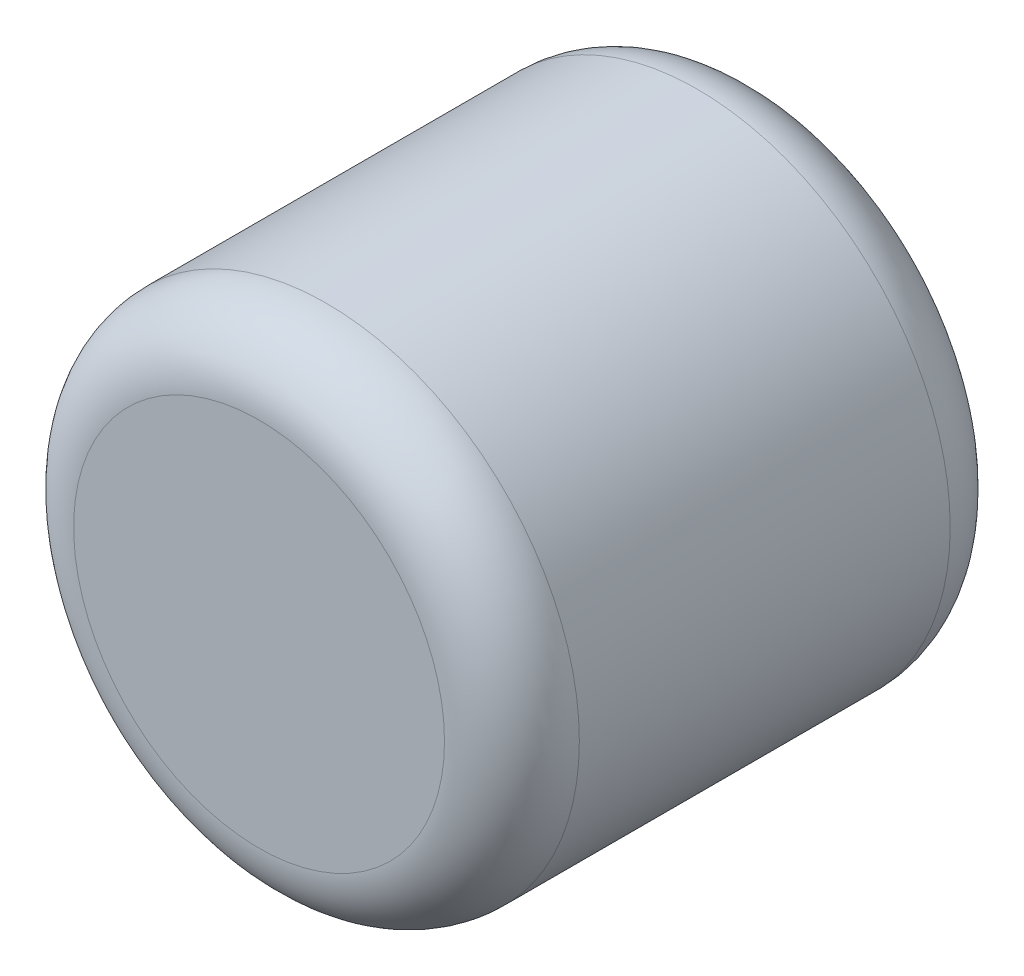
ISO-10303-21;
HEADER;
FILE_DESCRIPTION(('STEP AP214'),'2;1');
FILE_NAME('part.step','',(''),(''),'','','');
FILE_SCHEMA(('AUTOMOTIVE_DESIGN { 1 0 10303 214 1 1 1 1 }'));
ENDSEC;
DATA;
#1=APPLICATION_CONTEXT('core data for automotive mechanical design processes');
#2=APPLICATION_PROTOCOL_DEFINITION('international standard','automotive_design',2000,#1);
#3=PRODUCT_CONTEXT('',#1,'mechanical');
#4=PRODUCT('Part','Part','',(#3));
#5=PRODUCT_RELATED_PRODUCT_CATEGORY('part','',(#4));
#6=PRODUCT_DEFINITION_FORMATION('','',#4);
#7=PRODUCT_DEFINITION_CONTEXT('part definition',#1,'design');
#8=PRODUCT_DEFINITION('design','',#6,#7);
#9=PRODUCT_DEFINITION_SHAPE('','',#8);
#10=(LENGTH_UNIT() NAMED_UNIT(*) SI_UNIT(.MILLI.,.METRE.));
#11=(NAMED_UNIT(*) PLANE_ANGLE_UNIT() SI_UNIT($,.RADIAN.));
#12=(NAMED_UNIT(*) SI_UNIT($,.STERADIAN.) SOLID_ANGLE_UNIT());
#13=UNCERTAINTY_MEASURE_WITH_UNIT(LENGTH_MEASURE(1.E-05),#10,'distance_accuracy_value','');
#14=(GEOMETRIC_REPRESENTATION_CONTEXT(3) GLOBAL_UNCERTAINTY_ASSIGNED_CONTEXT((#13)) GLOBAL_UNIT_ASSIGNED_CONTEXT((#10,
#11,#12)) REPRESENTATION_CONTEXT('',''));
#15=CARTESIAN_POINT('',(0.,0.,0.));
#16=DIRECTION('',(0.,0.,1.));
#17=DIRECTION('',(1.,0.,0.));
#18=AXIS2_PLACEMENT_3D('',#15,#16,#17);
#19=CARTESIAN_POINT('',(0.,0.,30.));
#20=DIRECTION('',(0.,0.,-1.));
#21=DIRECTION('',(-1.,0.,0.));
#22=AXIS2_PLACEMENT_3D('',#19,#20,#21);
#23=CYLINDRICAL_SURFACE('',#22,15.);
#24=CARTESIAN_POINT('',(0.,0.,4.));
#25=DIRECTION('',(0.,0.,1.));
#26=DIRECTION('',(1.,0.,0.));
#27=AXIS2_PLACEMENT_3D('',#24,#25,#26);
#28=CIRCLE('',#27,15.);
#29=CARTESIAN_POINT('',(15.,0.,4.));
#30=VERTEX_POINT('',#29);
#31=EDGE_CURVE('E37',#30,#30,#28,.T.);
#32=ORIENTED_EDGE('',*,*,#31,.T.);
#33=EDGE_LOOP('',(#32));
#34=FACE_BOUND('',#33,.T.);
#35=CARTESIAN_POINT('',(0.,0.,26.));
#36=DIRECTION('',(0.,0.,1.));
#37=DIRECTION('',(1.,0.,0.));
#38=AXIS2_PLACEMENT_3D('',#35,#36,#37);
#39=CIRCLE('',#38,15.);
#40=CARTESIAN_POINT('',(15.,0.,26.));
#41=VERTEX_POINT('',#40);
#42=EDGE_CURVE('E41',#41,#41,#39,.F.);
#43=ORIENTED_EDGE('',*,*,#42,.T.);
#44=EDGE_LOOP('',(#43));
#45=FACE_BOUND('',#44,.T.);
#46=ADVANCED_FACE('F30',(#34,#45),#23,.T.);
#47=CARTESIAN_POINT('',(0.,0.,30.));
#48=DIRECTION('',(0.,0.,1.));
#49=DIRECTION('',(1.,0.,0.));
#50=AXIS2_PLACEMENT_3D('',#47,#48,#49);
#51=PLANE('',#50);
#52=CARTESIAN_POINT('',(0.,0.,30.));
#53=DIRECTION('',(0.,0.,1.));
#54=DIRECTION('',(1.,0.,0.));
#55=AXIS2_PLACEMENT_3D('',#52,#53,#54);
#56=CIRCLE('',#55,11.);
#57=CARTESIAN_POINT('',(11.,0.,30.));
#58=VERTEX_POINT('',#57);
#59=EDGE_CURVE('E45',#58,#58,#56,.T.);
#60=ORIENTED_EDGE('',*,*,#59,.T.);
#61=EDGE_LOOP('',(#60));
#62=FACE_BOUND('',#61,.T.);
#63=ADVANCED_FACE('F51',(#62),#51,.T.);
#64=CARTESIAN_POINT('',(0.,0.,0.));
#65=DIRECTION('',(0.,0.,1.));
#66=DIRECTION('',(1.,0.,0.));
#67=AXIS2_PLACEMENT_3D('',#64,#65,#66);
#68=PLANE('',#67);
#69=CARTESIAN_POINT('',(0.,0.,0.));
#70=DIRECTION('',(0.,0.,1.));
#71=DIRECTION('',(1.,0.,0.));
#72=AXIS2_PLACEMENT_3D('',#69,#70,#71);
#73=CIRCLE('',#72,11.);
#74=CARTESIAN_POINT('',(11.,0.,0.));
#75=VERTEX_POINT('',#74);
#76=EDGE_CURVE('E10',#75,#75,#73,.F.);
#77=ORIENTED_EDGE('',*,*,#76,.T.);
#78=EDGE_LOOP('',(#77));
#79=FACE_BOUND('',#78,.T.);
#80=ADVANCED_FACE('F55',(#79),#68,.F.);
#81=CARTESIAN_POINT('',(0.,0.,26.));
#82=DIRECTION('',(0.,0.,1.));
#83=DIRECTION('',(1.,0.,0.));
#84=AXIS2_PLACEMENT_3D('',#81,#82,#83);
#85=TOROIDAL_SURFACE('',#84,11.,4.);
#86=ORIENTED_EDGE('',*,*,#42,.F.);
#87=EDGE_LOOP('',(#86));
#88=FACE_BOUND('',#87,.T.);
#89=ORIENTED_EDGE('',*,*,#59,.F.);
#90=EDGE_LOOP('',(#89));
#91=FACE_BOUND('',#90,.T.);
#92=ADVANCED_FACE('F53',(#88,#91),#85,.T.);
#93=CARTESIAN_POINT('',(0.,0.,4.));
#94=DIRECTION('',(0.,0.,1.));
#95=DIRECTION('',(1.,0.,0.));
#96=AXIS2_PLACEMENT_3D('',#93,#94,#95);
#97=TOROIDAL_SURFACE('',#96,11.,4.);
#98=ORIENTED_EDGE('',*,*,#76,.F.);
#99=EDGE_LOOP('',(#98));
#100=FACE_BOUND('',#99,.T.);
#101=ORIENTED_EDGE('',*,*,#31,.F.);
#102=EDGE_LOOP('',(#101));
#103=FACE_BOUND('',#102,.T.);
#104=ADVANCED_FACE('F32',(#100,#103),#97,.T.);
#105=CLOSED_SHELL('',(#46,#63,#80,#92,#104));
#106=MANIFOLD_SOLID_BREP('B2',#105);
#107=ADVANCED_BREP_SHAPE_REPRESENTATION('',(#18,#106),#14);
#108=SHAPE_DEFINITION_REPRESENTATION(#9,#107);
ENDSEC;
END-ISO-10303-21;
